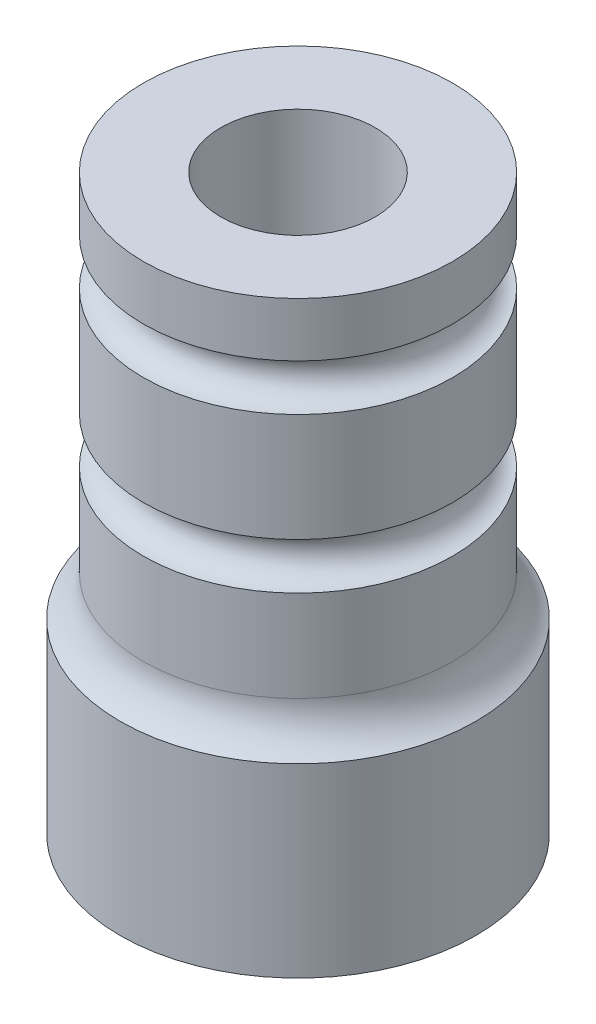
ISO-10303-21;
HEADER;
FILE_DESCRIPTION(('STEP AP214'),'2;1');
FILE_NAME('part.step','',(''),(''),'','','');
FILE_SCHEMA(('AUTOMOTIVE_DESIGN { 1 0 10303 214 1 1 1 1 }'));
ENDSEC;
DATA;
#1=APPLICATION_CONTEXT('core data for automotive mechanical design processes');
#2=APPLICATION_PROTOCOL_DEFINITION('international standard','automotive_design',2000,#1);
#3=PRODUCT_CONTEXT('',#1,'mechanical');
#4=PRODUCT('Part','Part','',(#3));
#5=PRODUCT_RELATED_PRODUCT_CATEGORY('part','',(#4));
#6=PRODUCT_DEFINITION_FORMATION('','',#4);
#7=PRODUCT_DEFINITION_CONTEXT('part definition',#1,'design');
#8=PRODUCT_DEFINITION('design','',#6,#7);
#9=PRODUCT_DEFINITION_SHAPE('','',#8);
#10=(LENGTH_UNIT() NAMED_UNIT(*) SI_UNIT(.MILLI.,.METRE.));
#11=(NAMED_UNIT(*) PLANE_ANGLE_UNIT() SI_UNIT($,.RADIAN.));
#12=(NAMED_UNIT(*) SI_UNIT($,.STERADIAN.) SOLID_ANGLE_UNIT());
#13=UNCERTAINTY_MEASURE_WITH_UNIT(LENGTH_MEASURE(1.E-05),#10,'distance_accuracy_value','');
#14=(GEOMETRIC_REPRESENTATION_CONTEXT(3) GLOBAL_UNCERTAINTY_ASSIGNED_CONTEXT((#13)) GLOBAL_UNIT_ASSIGNED_CONTEXT((#10,
#11,#12)) REPRESENTATION_CONTEXT('',''));
#15=CARTESIAN_POINT('',(0.,0.,0.));
#16=DIRECTION('',(0.,0.,1.));
#17=DIRECTION('',(1.,0.,0.));
#18=AXIS2_PLACEMENT_3D('',#15,#16,#17);
#19=CARTESIAN_POINT('',(0.,37.,0.));
#20=DIRECTION('',(0.,-1.,0.));
#21=DIRECTION('',(0.,0.,-1.));
#22=AXIS2_PLACEMENT_3D('',#19,#20,#21);
#23=CYLINDRICAL_SURFACE('',#22,10.);
#24=CARTESIAN_POINT('',(0.,23.4999883270452,0.));
#25=DIRECTION('',(0.,-1.,0.));
#26=DIRECTION('',(0.,0.,-1.));
#27=AXIS2_PLACEMENT_3D('',#24,#25,#26);
#28=CIRCLE('',#27,10.);
#29=CARTESIAN_POINT('',(0.,23.4999883270452,-10.));
#30=VERTEX_POINT('',#29);
#31=EDGE_CURVE('E46',#30,#30,#28,.T.);
#32=ORIENTED_EDGE('',*,*,#31,.F.);
#33=EDGE_LOOP('',(#32));
#34=FACE_BOUND('',#33,.T.);
#35=CARTESIAN_POINT('',(0.,30.5,0.));
#36=DIRECTION('',(0.,1.,0.));
#37=DIRECTION('',(0.,0.,1.));
#38=AXIS2_PLACEMENT_3D('',#35,#36,#37);
#39=CIRCLE('',#38,10.);
#40=CARTESIAN_POINT('',(0.,30.5,10.));
#41=VERTEX_POINT('',#40);
#42=EDGE_CURVE('E33',#41,#41,#39,.T.);
#43=ORIENTED_EDGE('',*,*,#42,.F.);
#44=EDGE_LOOP('',(#43));
#45=FACE_BOUND('',#44,.T.);
#46=ADVANCED_FACE('F29',(#34,#45),#23,.T.);
#47=CARTESIAN_POINT('',(0.,14.5980762113533,0.));
#48=DIRECTION('',(0.,-1.,0.));
#49=DIRECTION('',(0.,0.,-1.));
#50=AXIS2_PLACEMENT_3D('',#47,#48,#49);
#51=CIRCLE('',#50,10.);
#52=CARTESIAN_POINT('',(0.,14.5980762113533,-10.));
#53=VERTEX_POINT('',#52);
#54=EDGE_CURVE('E10',#53,#53,#51,.F.);
#55=ORIENTED_EDGE('',*,*,#54,.T.);
#56=EDGE_LOOP('',(#55));
#57=FACE_BOUND('',#56,.T.);
#58=CARTESIAN_POINT('',(0.,20.5000116729548,0.));
#59=DIRECTION('',(0.,1.,0.));
#60=DIRECTION('',(0.,0.,1.));
#61=AXIS2_PLACEMENT_3D('',#58,#59,#60);
#62=CIRCLE('',#61,10.);
#63=CARTESIAN_POINT('',(0.,20.5000116729548,10.));
#64=VERTEX_POINT('',#63);
#65=EDGE_CURVE('E49',#64,#64,#62,.T.);
#66=ORIENTED_EDGE('',*,*,#65,.F.);
#67=EDGE_LOOP('',(#66));
#68=FACE_BOUND('',#67,.T.);
#69=ADVANCED_FACE('F62',(#57,#68),#23,.T.);
#70=CARTESIAN_POINT('',(0.,8.,0.));
#71=DIRECTION('',(0.,1.,0.));
#72=DIRECTION('',(0.,0.,1.));
#73=AXIS2_PLACEMENT_3D('',#70,#71,#72);
#74=PLANE('',#73);
#75=CARTESIAN_POINT('',(-1.48838560742305,8.,5.97223260449409));
#76=DIRECTION('',(0.,1.,0.));
#77=DIRECTION('',(0.,0.,1.));
#78=AXIS2_PLACEMENT_3D('',#75,#76,#77);
#79=CIRCLE('',#78,1.5);
#80=CARTESIAN_POINT('',(-1.48838560742305,8.,7.47223260449409));
#81=VERTEX_POINT('',#80);
#82=EDGE_CURVE('E96',#81,#81,#79,.F.);
#83=ORIENTED_EDGE('',*,*,#82,.F.);
#84=EDGE_LOOP('',(#83));
#85=FACE_BOUND('',#84,.T.);
#86=CARTESIAN_POINT('',(0.,8.,0.));
#87=DIRECTION('',(0.,1.,0.));
#88=DIRECTION('',(0.,0.,1.));
#89=AXIS2_PLACEMENT_3D('',#86,#87,#88);
#90=CIRCLE('',#89,8.);
#91=CARTESIAN_POINT('',(0.,8.,8.));
#92=VERTEX_POINT('',#91);
#93=EDGE_CURVE('E100',#92,#92,#90,.T.);
#94=ORIENTED_EDGE('',*,*,#93,.F.);
#95=EDGE_LOOP('',(#94));
#96=FACE_BOUND('',#95,.T.);
#97=CARTESIAN_POINT('',(1.48838560742779,8.,-5.97223260449477));
#98=DIRECTION('',(0.,1.,0.));
#99=DIRECTION('',(0.,0.,1.));
#100=AXIS2_PLACEMENT_3D('',#97,#98,#99);
#101=CIRCLE('',#100,1.5);
#102=CARTESIAN_POINT('',(1.48838560742779,8.,-4.47223260449476));
#103=VERTEX_POINT('',#102);
#104=EDGE_CURVE('E88',#103,#103,#101,.F.);
#105=ORIENTED_EDGE('',*,*,#104,.F.);
#106=EDGE_LOOP('',(#105));
#107=FACE_BOUND('',#106,.T.);
#108=ADVANCED_FACE('F69',(#85,#96,#107),#74,.F.);
#109=CARTESIAN_POINT('',(0.,0.,0.));
#110=DIRECTION('',(0.,1.,0.));
#111=DIRECTION('',(0.,0.,1.));
#112=AXIS2_PLACEMENT_3D('',#109,#110,#111);
#113=PLANE('',#112);
#114=CARTESIAN_POINT('',(0.,0.,0.));
#115=DIRECTION('',(0.,1.,0.));
#116=DIRECTION('',(0.,0.,1.));
#117=AXIS2_PLACEMENT_3D('',#114,#115,#116);
#118=CIRCLE('',#117,11.5);
#119=CARTESIAN_POINT('',(0.,0.,11.5));
#120=VERTEX_POINT('',#119);
#121=EDGE_CURVE('E42',#120,#120,#118,.T.);
#122=ORIENTED_EDGE('',*,*,#121,.F.);
#123=EDGE_LOOP('',(#122));
#124=FACE_BOUND('',#123,.T.);
#125=CARTESIAN_POINT('',(0.,0.,0.));
#126=DIRECTION('',(0.,1.,0.));
#127=DIRECTION('',(0.,0.,1.));
#128=AXIS2_PLACEMENT_3D('',#125,#126,#127);
#129=CIRCLE('',#128,8.);
#130=CARTESIAN_POINT('',(0.,0.,8.));
#131=VERTEX_POINT('',#130);
#132=EDGE_CURVE('E103',#131,#131,#129,.T.);
#133=ORIENTED_EDGE('',*,*,#132,.T.);
#134=EDGE_LOOP('',(#133));
#135=FACE_BOUND('',#134,.T.);
#136=ADVANCED_FACE('F115',(#124,#135),#113,.F.);
#137=CARTESIAN_POINT('',(0.,8.,0.));
#138=DIRECTION('',(0.,-1.,0.));
#139=DIRECTION('',(0.,0.,-1.));
#140=AXIS2_PLACEMENT_3D('',#137,#138,#139);
#141=CYLINDRICAL_SURFACE('',#140,11.5);
#142=ORIENTED_EDGE('',*,*,#121,.T.);
#143=EDGE_LOOP('',(#142));
#144=FACE_BOUND('',#143,.T.);
#145=CARTESIAN_POINT('',(0.,12.,0.));
#146=DIRECTION('',(0.,1.,0.));
#147=DIRECTION('',(0.,0.,1.));
#148=AXIS2_PLACEMENT_3D('',#145,#146,#147);
#149=CIRCLE('',#148,11.5);
#150=CARTESIAN_POINT('',(0.,12.,11.5));
#151=VERTEX_POINT('',#150);
#152=EDGE_CURVE('E97',#151,#151,#149,.T.);
#153=ORIENTED_EDGE('',*,*,#152,.F.);
#154=EDGE_LOOP('',(#153));
#155=FACE_BOUND('',#154,.T.);
#156=ADVANCED_FACE('F121',(#144,#155),#141,.T.);
#157=CARTESIAN_POINT('',(0.,8.,0.));
#158=DIRECTION('',(0.,-1.,0.));
#159=DIRECTION('',(0.,0.,-1.));
#160=AXIS2_PLACEMENT_3D('',#157,#158,#159);
#161=CYLINDRICAL_SURFACE('',#160,8.);
#162=ORIENTED_EDGE('',*,*,#93,.T.);
#163=EDGE_LOOP('',(#162));
#164=FACE_BOUND('',#163,.T.);
#165=ORIENTED_EDGE('',*,*,#132,.F.);
#166=EDGE_LOOP('',(#165));
#167=FACE_BOUND('',#166,.T.);
#168=ADVANCED_FACE('F130',(#164,#167),#161,.F.);
#169=CARTESIAN_POINT('',(-1.48838560742305,10.1797366057816,5.97223260449409));
#170=DIRECTION('',(0.,-1.,0.));
#171=DIRECTION('',(0.,0.,-1.));
#172=AXIS2_PLACEMENT_3D('',#169,#170,#171);
#173=CYLINDRICAL_SURFACE('',#172,1.5);
#174=CARTESIAN_POINT('',(-1.48838560742305,10.1797366057816,5.97223260449409));
#175=DIRECTION('',(0.,1.,0.));
#176=DIRECTION('',(0.,0.,1.));
#177=AXIS2_PLACEMENT_3D('',#174,#175,#176);
#178=CIRCLE('',#177,1.5);
#179=CARTESIAN_POINT('',(-1.48838560742305,10.1797366057816,7.47223260449409));
#180=VERTEX_POINT('',#179);
#181=EDGE_CURVE('E93',#180,#180,#178,.T.);
#182=ORIENTED_EDGE('',*,*,#181,.T.);
#183=EDGE_LOOP('',(#182));
#184=FACE_BOUND('',#183,.T.);
#185=ORIENTED_EDGE('',*,*,#82,.T.);
#186=EDGE_LOOP('',(#185));
#187=FACE_BOUND('',#186,.T.);
#188=ADVANCED_FACE('F132',(#184,#187),#173,.F.);
#189=CARTESIAN_POINT('',(-1.48838560742305,10.1797366057816,5.97223260449409));
#190=DIRECTION('',(0.,1.,0.));
#191=DIRECTION('',(0.,0.,1.));
#192=AXIS2_PLACEMENT_3D('',#189,#190,#191);
#193=PLANE('',#192);
#194=ORIENTED_EDGE('',*,*,#181,.F.);
#195=EDGE_LOOP('',(#194));
#196=FACE_BOUND('',#195,.T.);
#197=ADVANCED_FACE('F156',(#196),#193,.F.);
#198=CARTESIAN_POINT('',(1.48838560742779,10.1797366057816,-5.97223260449477));
#199=DIRECTION('',(0.,-1.,0.));
#200=DIRECTION('',(0.,0.,-1.));
#201=AXIS2_PLACEMENT_3D('',#198,#199,#200);
#202=CYLINDRICAL_SURFACE('',#201,1.5);
#203=CARTESIAN_POINT('',(1.48838560742779,10.1797366057816,-5.97223260449477));
#204=DIRECTION('',(0.,1.,0.));
#205=DIRECTION('',(0.,0.,1.));
#206=AXIS2_PLACEMENT_3D('',#203,#204,#205);
#207=CIRCLE('',#206,1.5);
#208=CARTESIAN_POINT('',(1.48838560742779,10.1797366057816,-4.47223260449476));
#209=VERTEX_POINT('',#208);
#210=EDGE_CURVE('E85',#209,#209,#207,.T.);
#211=ORIENTED_EDGE('',*,*,#210,.T.);
#212=EDGE_LOOP('',(#211));
#213=FACE_BOUND('',#212,.T.);
#214=ORIENTED_EDGE('',*,*,#104,.T.);
#215=EDGE_LOOP('',(#214));
#216=FACE_BOUND('',#215,.T.);
#217=ADVANCED_FACE('F112',(#213,#216),#202,.F.);
#218=CARTESIAN_POINT('',(1.48838560742779,10.1797366057816,-5.97223260449477));
#219=DIRECTION('',(0.,1.,0.));
#220=DIRECTION('',(0.,0.,1.));
#221=AXIS2_PLACEMENT_3D('',#218,#219,#220);
#222=PLANE('',#221);
#223=ORIENTED_EDGE('',*,*,#210,.F.);
#224=EDGE_LOOP('',(#223));
#225=FACE_BOUND('',#224,.T.);
#226=ADVANCED_FACE('F145',(#225),#222,.F.);
#227=CARTESIAN_POINT('',(0.,14.5980762113533,0.));
#228=DIRECTION('',(0.,-1.,0.));
#229=DIRECTION('',(0.,0.,-1.));
#230=AXIS2_PLACEMENT_3D('',#227,#228,#229);
#231=TOROIDAL_SURFACE('',#230,13.,3.);
#232=ORIENTED_EDGE('',*,*,#152,.T.);
#233=EDGE_LOOP('',(#232));
#234=FACE_BOUND('',#233,.T.);
#235=ORIENTED_EDGE('',*,*,#54,.F.);
#236=EDGE_LOOP('',(#235));
#237=FACE_BOUND('',#236,.T.);
#238=ADVANCED_FACE('F31',(#234,#237),#231,.F.);
#239=CARTESIAN_POINT('',(0.,22.,0.));
#240=DIRECTION('',(0.,-1.,0.));
#241=DIRECTION('',(0.,0.,-1.));
#242=AXIS2_PLACEMENT_3D('',#239,#240,#241);
#243=TOROIDAL_SURFACE('',#242,9.99408233759948,1.5);
#244=ORIENTED_EDGE('',*,*,#31,.T.);
#245=EDGE_LOOP('',(#244));
#246=FACE_BOUND('',#245,.T.);
#247=ORIENTED_EDGE('',*,*,#65,.T.);
#248=EDGE_LOOP('',(#247));
#249=FACE_BOUND('',#248,.T.);
#250=ADVANCED_FACE('F144',(#246,#249),#243,.F.);
#251=CARTESIAN_POINT('',(0.,32.,0.));
#252=DIRECTION('',(0.,-1.,0.));
#253=DIRECTION('',(0.,0.,-1.));
#254=AXIS2_PLACEMENT_3D('',#251,#252,#253);
#255=TOROIDAL_SURFACE('',#254,10.,1.5);
#256=CARTESIAN_POINT('',(0.,33.5,0.));
#257=DIRECTION('',(0.,-1.,0.));
#258=DIRECTION('',(0.,0.,-1.));
#259=AXIS2_PLACEMENT_3D('',#256,#257,#258);
#260=CIRCLE('',#259,10.);
#261=CARTESIAN_POINT('',(0.,33.5,-10.));
#262=VERTEX_POINT('',#261);
#263=EDGE_CURVE('E52',#262,#262,#260,.T.);
#264=ORIENTED_EDGE('',*,*,#263,.T.);
#265=EDGE_LOOP('',(#264));
#266=FACE_BOUND('',#265,.T.);
#267=ORIENTED_EDGE('',*,*,#42,.T.);
#268=EDGE_LOOP('',(#267));
#269=FACE_BOUND('',#268,.T.);
#270=ADVANCED_FACE('F59',(#266,#269),#255,.F.);
#271=CARTESIAN_POINT('',(0.,12.,0.));
#272=DIRECTION('',(0.,1.,0.));
#273=DIRECTION('',(0.,0.,1.));
#274=AXIS2_PLACEMENT_3D('',#271,#272,#273);
#275=PLANE('',#274);
#276=CARTESIAN_POINT('',(0.,12.,0.));
#277=DIRECTION('',(0.,1.,0.));
#278=DIRECTION('',(0.,0.,1.));
#279=AXIS2_PLACEMENT_3D('',#276,#277,#278);
#280=CIRCLE('',#279,5.);
#281=CARTESIAN_POINT('',(0.,12.,5.));
#282=VERTEX_POINT('',#281);
#283=EDGE_CURVE('E37',#282,#282,#280,.F.);
#284=ORIENTED_EDGE('',*,*,#283,.F.);
#285=EDGE_LOOP('',(#284));
#286=FACE_BOUND('',#285,.T.);
#287=ADVANCED_FACE('F128',(#286),#275,.T.);
#288=CARTESIAN_POINT('',(0.,37.,0.));
#289=DIRECTION('',(0.,-1.,0.));
#290=DIRECTION('',(0.,0.,-1.));
#291=AXIS2_PLACEMENT_3D('',#288,#289,#290);
#292=CYLINDRICAL_SURFACE('',#291,5.);
#293=CARTESIAN_POINT('',(0.,37.,0.));
#294=DIRECTION('',(0.,1.,0.));
#295=DIRECTION('',(0.,0.,1.));
#296=AXIS2_PLACEMENT_3D('',#293,#294,#295);
#297=CIRCLE('',#296,5.);
#298=CARTESIAN_POINT('',(0.,37.,5.));
#299=VERTEX_POINT('',#298);
#300=EDGE_CURVE('E51',#299,#299,#297,.T.);
#301=ORIENTED_EDGE('',*,*,#300,.T.);
#302=EDGE_LOOP('',(#301));
#303=FACE_BOUND('',#302,.T.);
#304=ORIENTED_EDGE('',*,*,#283,.T.);
#305=EDGE_LOOP('',(#304));
#306=FACE_BOUND('',#305,.T.);
#307=ADVANCED_FACE('F79',(#303,#306),#292,.F.);
#308=CARTESIAN_POINT('',(0.,37.,0.));
#309=DIRECTION('',(0.,1.,0.));
#310=DIRECTION('',(0.,0.,1.));
#311=AXIS2_PLACEMENT_3D('',#308,#309,#310);
#312=PLANE('',#311);
#313=CARTESIAN_POINT('',(0.,37.,0.));
#314=DIRECTION('',(0.,1.,0.));
#315=DIRECTION('',(0.,0.,1.));
#316=AXIS2_PLACEMENT_3D('',#313,#314,#315);
#317=CIRCLE('',#316,10.);
#318=CARTESIAN_POINT('',(0.,37.,10.));
#319=VERTEX_POINT('',#318);
#320=EDGE_CURVE('E84',#319,#319,#317,.T.);
#321=ORIENTED_EDGE('',*,*,#320,.T.);
#322=EDGE_LOOP('',(#321));
#323=FACE_BOUND('',#322,.T.);
#324=ORIENTED_EDGE('',*,*,#300,.F.);
#325=EDGE_LOOP('',(#324));
#326=FACE_BOUND('',#325,.T.);
#327=ADVANCED_FACE('F74',(#323,#326),#312,.T.);
#328=ORIENTED_EDGE('',*,*,#320,.F.);
#329=EDGE_LOOP('',(#328));
#330=FACE_BOUND('',#329,.T.);
#331=ORIENTED_EDGE('',*,*,#263,.F.);
#332=EDGE_LOOP('',(#331));
#333=FACE_BOUND('',#332,.T.);
#334=ADVANCED_FACE('F65',(#330,#333),#23,.T.);
#335=CLOSED_SHELL('',(#46,#69,#108,#136,#156,#168,#188,#197,#217,#226,#238,#250,#270,#287,#307,
#327,#334));
#336=MANIFOLD_SOLID_BREP('B2',#335);
#337=ADVANCED_BREP_SHAPE_REPRESENTATION('',(#18,#336),#14);
#338=SHAPE_DEFINITION_REPRESENTATION(#9,#337);
ENDSEC;
END-ISO-10303-21;
